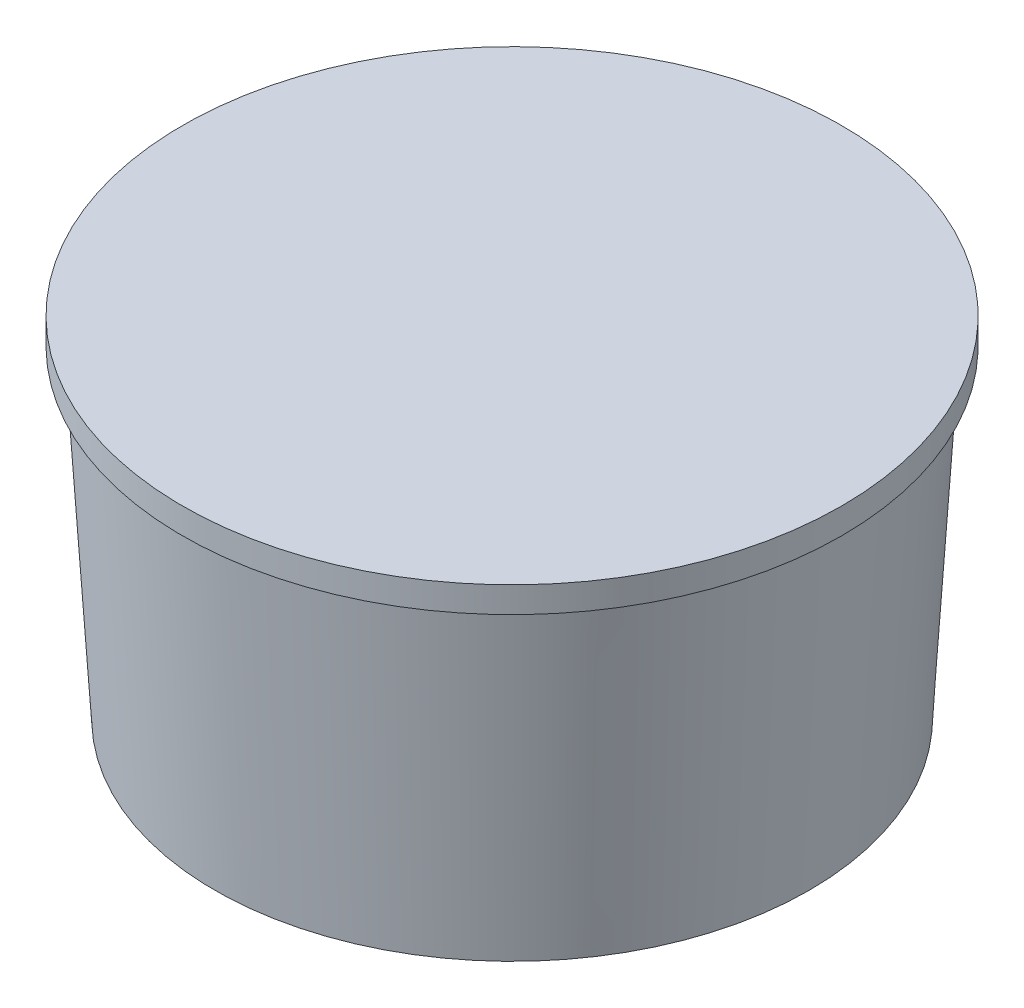
ISO-10303-21;
HEADER;
FILE_DESCRIPTION(('STEP AP214'),'2;1');
FILE_NAME('part.step','',(''),(''),'','','');
FILE_SCHEMA(('AUTOMOTIVE_DESIGN { 1 0 10303 214 1 1 1 1 }'));
ENDSEC;
DATA;
#1=APPLICATION_CONTEXT('core data for automotive mechanical design processes');
#2=APPLICATION_PROTOCOL_DEFINITION('international standard','automotive_design',2000,#1);
#3=PRODUCT_CONTEXT('',#1,'mechanical');
#4=PRODUCT('Part','Part','',(#3));
#5=PRODUCT_RELATED_PRODUCT_CATEGORY('part','',(#4));
#6=PRODUCT_DEFINITION_FORMATION('','',#4);
#7=PRODUCT_DEFINITION_CONTEXT('part definition',#1,'design');
#8=PRODUCT_DEFINITION('design','',#6,#7);
#9=PRODUCT_DEFINITION_SHAPE('','',#8);
#10=(LENGTH_UNIT() NAMED_UNIT(*) SI_UNIT(.MILLI.,.METRE.));
#11=(NAMED_UNIT(*) PLANE_ANGLE_UNIT() SI_UNIT($,.RADIAN.));
#12=(NAMED_UNIT(*) SI_UNIT($,.STERADIAN.) SOLID_ANGLE_UNIT());
#13=UNCERTAINTY_MEASURE_WITH_UNIT(LENGTH_MEASURE(1.E-05),#10,'distance_accuracy_value','');
#14=(GEOMETRIC_REPRESENTATION_CONTEXT(3) GLOBAL_UNCERTAINTY_ASSIGNED_CONTEXT((#13)) GLOBAL_UNIT_ASSIGNED_CONTEXT((#10,
#11,#12)) REPRESENTATION_CONTEXT('',''));
#15=CARTESIAN_POINT('',(0.,0.,0.));
#16=DIRECTION('',(0.,0.,1.));
#17=DIRECTION('',(1.,0.,0.));
#18=AXIS2_PLACEMENT_3D('',#15,#16,#17);
#19=CARTESIAN_POINT('',(0.,0.,0.));
#20=DIRECTION('',(0.,1.,0.));
#21=DIRECTION('',(-1.,0.,0.));
#22=AXIS2_PLACEMENT_3D('',#19,#20,#21);
#23=PLANE('',#22);
#24=CARTESIAN_POINT('',(0.,0.,0.));
#25=DIRECTION('',(0.,-1.,0.));
#26=DIRECTION('',(1.,0.,0.));
#27=AXIS2_PLACEMENT_3D('',#24,#25,#26);
#28=CIRCLE('',#27,25.5);
#29=CARTESIAN_POINT('',(25.5,0.,0.));
#30=VERTEX_POINT('',#29);
#31=EDGE_CURVE('E42',#30,#30,#28,.T.);
#32=ORIENTED_EDGE('',*,*,#31,.F.);
#33=EDGE_LOOP('',(#32));
#34=FACE_BOUND('',#33,.T.);
#35=ADVANCED_FACE('F31',(#34),#23,.T.);
#36=CARTESIAN_POINT('',(0.,-2.,0.));
#37=DIRECTION('',(0.,-1.,0.));
#38=DIRECTION('',(1.,0.,0.));
#39=AXIS2_PLACEMENT_3D('',#36,#37,#38);
#40=CYLINDRICAL_SURFACE('',#39,25.5);
#41=ORIENTED_EDGE('',*,*,#31,.T.);
#42=EDGE_LOOP('',(#41));
#43=FACE_BOUND('',#42,.T.);
#44=CARTESIAN_POINT('',(0.,-1.99999999999999,0.));
#45=DIRECTION('',(0.,-1.,0.));
#46=DIRECTION('',(1.,0.,0.));
#47=AXIS2_PLACEMENT_3D('',#44,#45,#46);
#48=CIRCLE('',#47,25.5);
#49=CARTESIAN_POINT('',(25.5,-2.,0.));
#50=VERTEX_POINT('',#49);
#51=EDGE_CURVE('E46',#50,#50,#48,.T.);
#52=ORIENTED_EDGE('',*,*,#51,.F.);
#53=EDGE_LOOP('',(#52));
#54=FACE_BOUND('',#53,.T.);
#55=ADVANCED_FACE('F78',(#43,#54),#40,.T.);
#56=CARTESIAN_POINT('',(25.5,-2.,0.));
#57=DIRECTION('',(0.,-1.,0.));
#58=DIRECTION('',(1.,0.,0.));
#59=AXIS2_PLACEMENT_3D('',#56,#57,#58);
#60=PLANE('',#59);
#61=ORIENTED_EDGE('',*,*,#51,.T.);
#62=EDGE_LOOP('',(#61));
#63=FACE_BOUND('',#62,.T.);
#64=CARTESIAN_POINT('',(0.,-1.99999999999999,0.));
#65=DIRECTION('',(0.,-1.,0.));
#66=DIRECTION('',(1.,0.,0.));
#67=AXIS2_PLACEMENT_3D('',#64,#65,#66);
#68=CIRCLE('',#67,24.5);
#69=CARTESIAN_POINT('',(24.5,-1.99999999999999,0.));
#70=VERTEX_POINT('',#69);
#71=EDGE_CURVE('E51',#70,#70,#68,.T.);
#72=ORIENTED_EDGE('',*,*,#71,.F.);
#73=EDGE_LOOP('',(#72));
#74=FACE_BOUND('',#73,.T.);
#75=ADVANCED_FACE('F74',(#63,#74),#60,.T.);
#76=CARTESIAN_POINT('',(0.,-27.,0.));
#77=DIRECTION('',(0.,1.,0.));
#78=DIRECTION('',(-1.,0.,0.));
#79=AXIS2_PLACEMENT_3D('',#76,#77,#78);
#80=CONICAL_SURFACE('',#79,23.,0.0599281551212078);
#81=ORIENTED_EDGE('',*,*,#71,.T.);
#82=EDGE_LOOP('',(#81));
#83=FACE_BOUND('',#82,.T.);
#84=CARTESIAN_POINT('',(0.,-27.,0.));
#85=DIRECTION('',(0.,-1.,0.));
#86=DIRECTION('',(1.,0.,0.));
#87=AXIS2_PLACEMENT_3D('',#84,#85,#86);
#88=CIRCLE('',#87,23.);
#89=CARTESIAN_POINT('',(23.,-27.,0.));
#90=VERTEX_POINT('',#89);
#91=EDGE_CURVE('E54',#90,#90,#88,.T.);
#92=ORIENTED_EDGE('',*,*,#91,.F.);
#93=EDGE_LOOP('',(#92));
#94=FACE_BOUND('',#93,.T.);
#95=ADVANCED_FACE('F65',(#83,#94),#80,.T.);
#96=CARTESIAN_POINT('',(23.,-27.,0.));
#97=DIRECTION('',(0.,-1.,0.));
#98=DIRECTION('',(1.,0.,0.));
#99=AXIS2_PLACEMENT_3D('',#96,#97,#98);
#100=PLANE('',#99);
#101=ORIENTED_EDGE('',*,*,#91,.T.);
#102=EDGE_LOOP('',(#101));
#103=FACE_BOUND('',#102,.T.);
#104=CARTESIAN_POINT('',(0.,-27.,0.));
#105=DIRECTION('',(0.,-1.,0.));
#106=DIRECTION('',(1.,0.,0.));
#107=AXIS2_PLACEMENT_3D('',#104,#105,#106);
#108=CIRCLE('',#107,22.);
#109=CARTESIAN_POINT('',(22.,-27.,0.));
#110=VERTEX_POINT('',#109);
#111=EDGE_CURVE('E57',#110,#110,#108,.T.);
#112=ORIENTED_EDGE('',*,*,#111,.F.);
#113=EDGE_LOOP('',(#112));
#114=FACE_BOUND('',#113,.T.);
#115=ADVANCED_FACE('F63',(#103,#114),#100,.T.);
#116=CARTESIAN_POINT('',(0.,-2.,0.));
#117=DIRECTION('',(0.,-1.,0.));
#118=DIRECTION('',(1.,0.,0.));
#119=AXIS2_PLACEMENT_3D('',#116,#117,#118);
#120=CYLINDRICAL_SURFACE('',#119,22.);
#121=CARTESIAN_POINT('',(0.,-6.,0.));
#122=DIRECTION('',(0.,-1.,0.));
#123=DIRECTION('',(1.,0.,0.));
#124=AXIS2_PLACEMENT_3D('',#121,#122,#123);
#125=CIRCLE('',#124,22.);
#126=CARTESIAN_POINT('',(22.,-6.,0.));
#127=VERTEX_POINT('',#126);
#128=EDGE_CURVE('E10',#127,#127,#125,.F.);
#129=ORIENTED_EDGE('',*,*,#128,.T.);
#130=EDGE_LOOP('',(#129));
#131=FACE_BOUND('',#130,.T.);
#132=ORIENTED_EDGE('',*,*,#111,.T.);
#133=EDGE_LOOP('',(#132));
#134=FACE_BOUND('',#133,.T.);
#135=ADVANCED_FACE('F61',(#131,#134),#120,.F.);
#136=CARTESIAN_POINT('',(0.,-2.,0.));
#137=DIRECTION('',(0.,-1.,0.));
#138=DIRECTION('',(1.,0.,0.));
#139=AXIS2_PLACEMENT_3D('',#136,#137,#138);
#140=PLANE('',#139);
#141=CARTESIAN_POINT('',(0.,-2.,0.));
#142=DIRECTION('',(0.,-1.,0.));
#143=DIRECTION('',(1.,0.,0.));
#144=AXIS2_PLACEMENT_3D('',#141,#142,#143);
#145=CIRCLE('',#144,18.);
#146=CARTESIAN_POINT('',(18.,-2.,0.));
#147=VERTEX_POINT('',#146);
#148=EDGE_CURVE('E38',#147,#147,#145,.T.);
#149=ORIENTED_EDGE('',*,*,#148,.T.);
#150=EDGE_LOOP('',(#149));
#151=FACE_BOUND('',#150,.T.);
#152=ADVANCED_FACE('F72',(#151),#140,.T.);
#153=CARTESIAN_POINT('',(0.,-6.,0.));
#154=DIRECTION('',(0.,-1.,0.));
#155=DIRECTION('',(1.,0.,0.));
#156=AXIS2_PLACEMENT_3D('',#153,#154,#155);
#157=TOROIDAL_SURFACE('',#156,18.,4.);
#158=ORIENTED_EDGE('',*,*,#128,.F.);
#159=EDGE_LOOP('',(#158));
#160=FACE_BOUND('',#159,.T.);
#161=ORIENTED_EDGE('',*,*,#148,.F.);
#162=EDGE_LOOP('',(#161));
#163=FACE_BOUND('',#162,.T.);
#164=ADVANCED_FACE('F33',(#160,#163),#157,.F.);
#165=CLOSED_SHELL('',(#35,#55,#75,#95,#115,#135,#152,#164));
#166=MANIFOLD_SOLID_BREP('B2',#165);
#167=ADVANCED_BREP_SHAPE_REPRESENTATION('',(#18,#166),#14);
#168=SHAPE_DEFINITION_REPRESENTATION(#9,#167);
ENDSEC;
END-ISO-10303-21;
